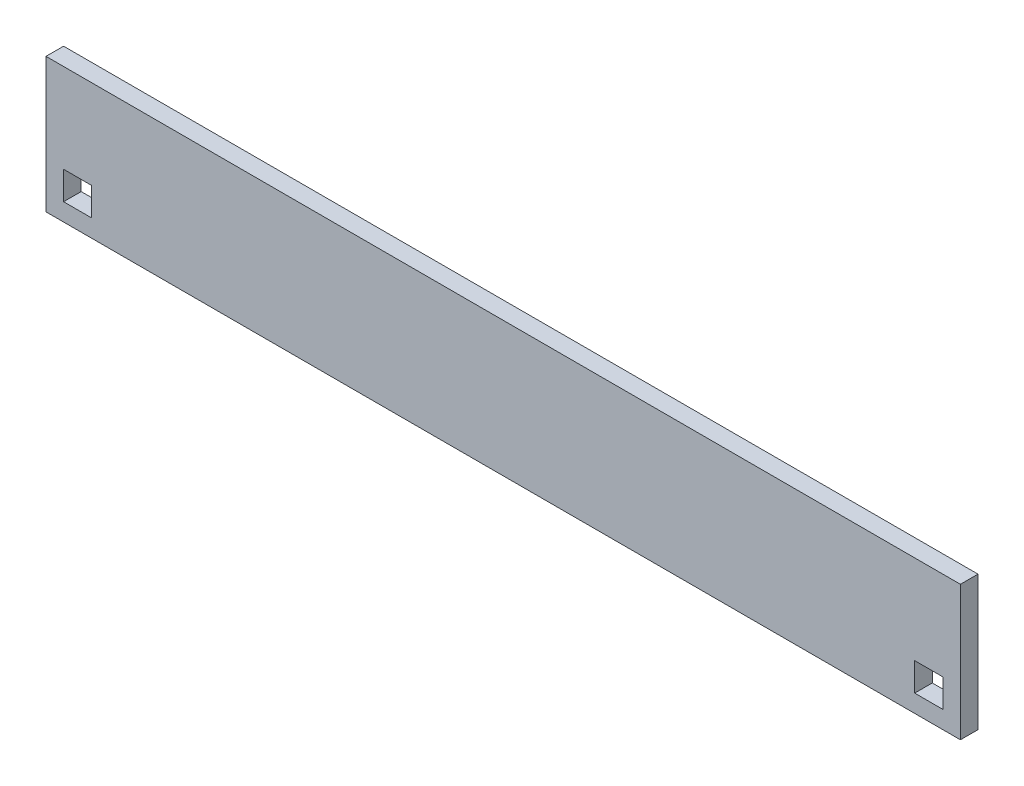
ISO-10303-21;
HEADER;
FILE_DESCRIPTION(('STEP AP214'),'2;1');
FILE_NAME('part.step','',(''),(''),'','','');
FILE_SCHEMA(('AUTOMOTIVE_DESIGN { 1 0 10303 214 1 1 1 1 }'));
ENDSEC;
DATA;
#1=APPLICATION_CONTEXT('core data for automotive mechanical design processes');
#2=APPLICATION_PROTOCOL_DEFINITION('international standard','automotive_design',2000,#1);
#3=PRODUCT_CONTEXT('',#1,'mechanical');
#4=PRODUCT('Part','Part','',(#3));
#5=PRODUCT_RELATED_PRODUCT_CATEGORY('part','',(#4));
#6=PRODUCT_DEFINITION_FORMATION('','',#4);
#7=PRODUCT_DEFINITION_CONTEXT('part definition',#1,'design');
#8=PRODUCT_DEFINITION('design','',#6,#7);
#9=PRODUCT_DEFINITION_SHAPE('','',#8);
#10=(LENGTH_UNIT() NAMED_UNIT(*) SI_UNIT(.MILLI.,.METRE.));
#11=(NAMED_UNIT(*) PLANE_ANGLE_UNIT() SI_UNIT($,.RADIAN.));
#12=(NAMED_UNIT(*) SI_UNIT($,.STERADIAN.) SOLID_ANGLE_UNIT());
#13=UNCERTAINTY_MEASURE_WITH_UNIT(LENGTH_MEASURE(1.E-05),#10,'distance_accuracy_value','');
#14=(GEOMETRIC_REPRESENTATION_CONTEXT(3) GLOBAL_UNCERTAINTY_ASSIGNED_CONTEXT((#13)) GLOBAL_UNIT_ASSIGNED_CONTEXT((#10,
#11,#12)) REPRESENTATION_CONTEXT('',''));
#15=CARTESIAN_POINT('',(0.,0.,0.));
#16=DIRECTION('',(0.,0.,1.));
#17=DIRECTION('',(1.,0.,0.));
#18=AXIS2_PLACEMENT_3D('',#15,#16,#17);
#19=CARTESIAN_POINT('',(0.,0.,5.));
#20=DIRECTION('',(1.,0.,0.));
#21=DIRECTION('',(0.,0.,-1.));
#22=AXIS2_PLACEMENT_3D('',#19,#20,#21);
#23=PLANE('',#22);
#24=DIRECTION('',(0.,-1.,0.));
#25=VECTOR('',#24,1.);
#26=CARTESIAN_POINT('',(0.,0.,0.));
#27=LINE('',#26,#25);
#28=CARTESIAN_POINT('',(0.,38.3035,0.));
#29=VERTEX_POINT('',#28);
#30=CARTESIAN_POINT('',(0.,0.,0.));
#31=VERTEX_POINT('',#30);
#32=EDGE_CURVE('E150',#29,#31,#27,.T.);
#33=ORIENTED_EDGE('',*,*,#32,.T.);
#34=DIRECTION('',(0.,0.,-1.));
#35=VECTOR('',#34,1.);
#36=CARTESIAN_POINT('',(0.,0.,5.));
#37=LINE('',#36,#35);
#38=CARTESIAN_POINT('',(0.,0.,5.));
#39=VERTEX_POINT('',#38);
#40=EDGE_CURVE('E197',#39,#31,#37,.T.);
#41=ORIENTED_EDGE('',*,*,#40,.F.);
#42=DIRECTION('',(0.,-1.,0.));
#43=VECTOR('',#42,1.);
#44=CARTESIAN_POINT('',(0.,0.,5.));
#45=LINE('',#44,#43);
#46=CARTESIAN_POINT('',(0.,38.3035,5.));
#47=VERTEX_POINT('',#46);
#48=EDGE_CURVE('E171',#47,#39,#45,.T.);
#49=ORIENTED_EDGE('',*,*,#48,.F.);
#50=DIRECTION('',(0.,0.,-1.));
#51=VECTOR('',#50,1.);
#52=CARTESIAN_POINT('',(0.,38.3035,5.));
#53=LINE('',#52,#51);
#54=EDGE_CURVE('E181',#47,#29,#53,.T.);
#55=ORIENTED_EDGE('',*,*,#54,.T.);
#56=EDGE_LOOP('',(#33,#41,#49,#55));
#57=FACE_BOUND('',#56,.T.);
#58=ADVANCED_FACE('F32',(#57),#23,.F.);
#59=CARTESIAN_POINT('',(0.,0.,5.));
#60=DIRECTION('',(0.,1.,0.));
#61=DIRECTION('',(0.,0.,1.));
#62=AXIS2_PLACEMENT_3D('',#59,#60,#61);
#63=PLANE('',#62);
#64=DIRECTION('',(1.,0.,0.));
#65=VECTOR('',#64,1.);
#66=CARTESIAN_POINT('',(0.,0.,0.));
#67=LINE('',#66,#65);
#68=CARTESIAN_POINT('',(260.,0.,0.));
#69=VERTEX_POINT('',#68);
#70=EDGE_CURVE('E184',#31,#69,#67,.T.);
#71=ORIENTED_EDGE('',*,*,#70,.T.);
#72=DIRECTION('',(0.,0.,-1.));
#73=VECTOR('',#72,1.);
#74=CARTESIAN_POINT('',(260.,0.,5.));
#75=LINE('',#74,#73);
#76=CARTESIAN_POINT('',(260.,0.,5.));
#77=VERTEX_POINT('',#76);
#78=EDGE_CURVE('E194',#77,#69,#75,.T.);
#79=ORIENTED_EDGE('',*,*,#78,.F.);
#80=DIRECTION('',(1.,0.,0.));
#81=VECTOR('',#80,1.);
#82=CARTESIAN_POINT('',(0.,0.,5.));
#83=LINE('',#82,#81);
#84=EDGE_CURVE('E174',#39,#77,#83,.T.);
#85=ORIENTED_EDGE('',*,*,#84,.F.);
#86=ORIENTED_EDGE('',*,*,#40,.T.);
#87=EDGE_LOOP('',(#71,#79,#85,#86));
#88=FACE_BOUND('',#87,.T.);
#89=ADVANCED_FACE('F234',(#88),#63,.F.);
#90=CARTESIAN_POINT('',(260.,0.,5.));
#91=DIRECTION('',(-1.,0.,0.));
#92=DIRECTION('',(0.,0.,1.));
#93=AXIS2_PLACEMENT_3D('',#90,#91,#92);
#94=PLANE('',#93);
#95=DIRECTION('',(0.,1.,0.));
#96=VECTOR('',#95,1.);
#97=CARTESIAN_POINT('',(260.,0.,0.));
#98=LINE('',#97,#96);
#99=CARTESIAN_POINT('',(260.,38.3035,0.));
#100=VERTEX_POINT('',#99);
#101=EDGE_CURVE('E186',#69,#100,#98,.T.);
#102=ORIENTED_EDGE('',*,*,#101,.T.);
#103=DIRECTION('',(0.,0.,-1.));
#104=VECTOR('',#103,1.);
#105=CARTESIAN_POINT('',(260.,38.3035,5.));
#106=LINE('',#105,#104);
#107=CARTESIAN_POINT('',(260.,38.3035,5.));
#108=VERTEX_POINT('',#107);
#109=EDGE_CURVE('E191',#108,#100,#106,.T.);
#110=ORIENTED_EDGE('',*,*,#109,.F.);
#111=DIRECTION('',(0.,1.,0.));
#112=VECTOR('',#111,1.);
#113=CARTESIAN_POINT('',(260.,0.,5.));
#114=LINE('',#113,#112);
#115=EDGE_CURVE('E177',#77,#108,#114,.T.);
#116=ORIENTED_EDGE('',*,*,#115,.F.);
#117=ORIENTED_EDGE('',*,*,#78,.T.);
#118=EDGE_LOOP('',(#102,#110,#116,#117));
#119=FACE_BOUND('',#118,.T.);
#120=ADVANCED_FACE('F239',(#119),#94,.F.);
#121=CARTESIAN_POINT('',(0.,38.3035,5.));
#122=DIRECTION('',(0.,-1.,0.));
#123=DIRECTION('',(0.,0.,-1.));
#124=AXIS2_PLACEMENT_3D('',#121,#122,#123);
#125=PLANE('',#124);
#126=DIRECTION('',(-1.,0.,0.));
#127=VECTOR('',#126,1.);
#128=CARTESIAN_POINT('',(0.,38.3035,0.));
#129=LINE('',#128,#127);
#130=EDGE_CURVE('E175',#100,#29,#129,.T.);
#131=ORIENTED_EDGE('',*,*,#130,.T.);
#132=ORIENTED_EDGE('',*,*,#54,.F.);
#133=DIRECTION('',(-1.,0.,0.));
#134=VECTOR('',#133,1.);
#135=CARTESIAN_POINT('',(0.,38.3035,5.));
#136=LINE('',#135,#134);
#137=EDGE_CURVE('E179',#108,#47,#136,.T.);
#138=ORIENTED_EDGE('',*,*,#137,.F.);
#139=ORIENTED_EDGE('',*,*,#109,.T.);
#140=EDGE_LOOP('',(#131,#132,#138,#139));
#141=FACE_BOUND('',#140,.T.);
#142=ADVANCED_FACE('F254',(#141),#125,.F.);
#143=CARTESIAN_POINT('',(0.,0.,5.));
#144=DIRECTION('',(0.,0.,-1.));
#145=DIRECTION('',(-1.,0.,0.));
#146=AXIS2_PLACEMENT_3D('',#143,#144,#145);
#147=PLANE('',#146);
#148=DIRECTION('',(1.,0.,0.));
#149=VECTOR('',#148,1.);
#150=CARTESIAN_POINT('',(5.,5.,5.));
#151=LINE('',#150,#149);
#152=CARTESIAN_POINT('',(5.,5.,5.));
#153=VERTEX_POINT('',#152);
#154=CARTESIAN_POINT('',(13.,5.,5.));
#155=VERTEX_POINT('',#154);
#156=EDGE_CURVE('E136',#153,#155,#151,.T.);
#157=ORIENTED_EDGE('',*,*,#156,.F.);
#158=DIRECTION('',(0.,-1.,0.));
#159=VECTOR('',#158,1.);
#160=CARTESIAN_POINT('',(5.,13.,5.));
#161=LINE('',#160,#159);
#162=CARTESIAN_POINT('',(5.,13.,5.));
#163=VERTEX_POINT('',#162);
#164=EDGE_CURVE('E46',#163,#153,#161,.T.);
#165=ORIENTED_EDGE('',*,*,#164,.F.);
#166=DIRECTION('',(-1.,0.,0.));
#167=VECTOR('',#166,1.);
#168=CARTESIAN_POINT('',(5.,13.,5.));
#169=LINE('',#168,#167);
#170=CARTESIAN_POINT('',(13.,13.,5.));
#171=VERTEX_POINT('',#170);
#172=EDGE_CURVE('E143',#171,#163,#169,.T.);
#173=ORIENTED_EDGE('',*,*,#172,.F.);
#174=DIRECTION('',(0.,1.,0.));
#175=VECTOR('',#174,1.);
#176=CARTESIAN_POINT('',(13.,13.,5.));
#177=LINE('',#176,#175);
#178=EDGE_CURVE('E126',#155,#171,#177,.T.);
#179=ORIENTED_EDGE('',*,*,#178,.F.);
#180=EDGE_LOOP('',(#157,#165,#173,#179));
#181=FACE_BOUND('',#180,.T.);
#182=DIRECTION('',(-1.,0.,0.));
#183=VECTOR('',#182,1.);
#184=CARTESIAN_POINT('',(255.,13.,5.));
#185=LINE('',#184,#183);
#186=CARTESIAN_POINT('',(255.,13.,5.));
#187=VERTEX_POINT('',#186);
#188=CARTESIAN_POINT('',(247.,13.,5.));
#189=VERTEX_POINT('',#188);
#190=EDGE_CURVE('E154',#187,#189,#185,.T.);
#191=ORIENTED_EDGE('',*,*,#190,.F.);
#192=DIRECTION('',(0.,1.,0.));
#193=VECTOR('',#192,1.);
#194=CARTESIAN_POINT('',(255.,13.,5.));
#195=LINE('',#194,#193);
#196=CARTESIAN_POINT('',(255.,5.,5.));
#197=VERTEX_POINT('',#196);
#198=EDGE_CURVE('E54',#197,#187,#195,.T.);
#199=ORIENTED_EDGE('',*,*,#198,.F.);
#200=DIRECTION('',(1.,0.,0.));
#201=VECTOR('',#200,1.);
#202=CARTESIAN_POINT('',(255.,5.,5.));
#203=LINE('',#202,#201);
#204=CARTESIAN_POINT('',(247.,5.,5.));
#205=VERTEX_POINT('',#204);
#206=EDGE_CURVE('E160',#205,#197,#203,.T.);
#207=ORIENTED_EDGE('',*,*,#206,.F.);
#208=DIRECTION('',(0.,-1.,0.));
#209=VECTOR('',#208,1.);
#210=CARTESIAN_POINT('',(247.,13.,5.));
#211=LINE('',#210,#209);
#212=EDGE_CURVE('E157',#189,#205,#211,.T.);
#213=ORIENTED_EDGE('',*,*,#212,.F.);
#214=EDGE_LOOP('',(#191,#199,#207,#213));
#215=FACE_BOUND('',#214,.T.);
#216=ORIENTED_EDGE('',*,*,#48,.T.);
#217=ORIENTED_EDGE('',*,*,#84,.T.);
#218=ORIENTED_EDGE('',*,*,#115,.T.);
#219=ORIENTED_EDGE('',*,*,#137,.T.);
#220=EDGE_LOOP('',(#216,#217,#218,#219));
#221=FACE_BOUND('',#220,.T.);
#222=ADVANCED_FACE('F140',(#181,#215,#221),#147,.F.);
#223=CARTESIAN_POINT('',(0.,0.,0.));
#224=DIRECTION('',(0.,0.,-1.));
#225=DIRECTION('',(-1.,0.,0.));
#226=AXIS2_PLACEMENT_3D('',#223,#224,#225);
#227=PLANE('',#226);
#228=DIRECTION('',(0.,1.,0.));
#229=VECTOR('',#228,1.);
#230=CARTESIAN_POINT('',(5.,0.,0.));
#231=LINE('',#230,#229);
#232=CARTESIAN_POINT('',(5.,5.,0.));
#233=VERTEX_POINT('',#232);
#234=CARTESIAN_POINT('',(5.,13.,0.));
#235=VERTEX_POINT('',#234);
#236=EDGE_CURVE('E11',#233,#235,#231,.T.);
#237=ORIENTED_EDGE('',*,*,#236,.F.);
#238=DIRECTION('',(-1.,0.,0.));
#239=VECTOR('',#238,1.);
#240=CARTESIAN_POINT('',(0.,5.,0.));
#241=LINE('',#240,#239);
#242=CARTESIAN_POINT('',(13.,5.,0.));
#243=VERTEX_POINT('',#242);
#244=EDGE_CURVE('E209',#243,#233,#241,.T.);
#245=ORIENTED_EDGE('',*,*,#244,.F.);
#246=DIRECTION('',(0.,-1.,0.));
#247=VECTOR('',#246,1.);
#248=CARTESIAN_POINT('',(13.,0.,0.));
#249=LINE('',#248,#247);
#250=CARTESIAN_POINT('',(13.,13.,0.));
#251=VERTEX_POINT('',#250);
#252=EDGE_CURVE('E129',#251,#243,#249,.T.);
#253=ORIENTED_EDGE('',*,*,#252,.F.);
#254=DIRECTION('',(1.,0.,0.));
#255=VECTOR('',#254,1.);
#256=CARTESIAN_POINT('',(0.,13.,0.));
#257=LINE('',#256,#255);
#258=EDGE_CURVE('E39',#235,#251,#257,.T.);
#259=ORIENTED_EDGE('',*,*,#258,.F.);
#260=EDGE_LOOP('',(#237,#245,#253,#259));
#261=FACE_BOUND('',#260,.T.);
#262=DIRECTION('',(0.,-1.,0.));
#263=VECTOR('',#262,1.);
#264=CARTESIAN_POINT('',(255.,0.,0.));
#265=LINE('',#264,#263);
#266=CARTESIAN_POINT('',(255.,13.,0.));
#267=VERTEX_POINT('',#266);
#268=CARTESIAN_POINT('',(255.,5.,0.));
#269=VERTEX_POINT('',#268);
#270=EDGE_CURVE('E207',#267,#269,#265,.T.);
#271=ORIENTED_EDGE('',*,*,#270,.F.);
#272=DIRECTION('',(1.,0.,0.));
#273=VECTOR('',#272,1.);
#274=CARTESIAN_POINT('',(0.,13.,0.));
#275=LINE('',#274,#273);
#276=CARTESIAN_POINT('',(247.,13.,0.));
#277=VERTEX_POINT('',#276);
#278=EDGE_CURVE('E200',#277,#267,#275,.T.);
#279=ORIENTED_EDGE('',*,*,#278,.F.);
#280=DIRECTION('',(0.,1.,0.));
#281=VECTOR('',#280,1.);
#282=CARTESIAN_POINT('',(247.,0.,0.));
#283=LINE('',#282,#281);
#284=CARTESIAN_POINT('',(247.,5.,0.));
#285=VERTEX_POINT('',#284);
#286=EDGE_CURVE('E202',#285,#277,#283,.T.);
#287=ORIENTED_EDGE('',*,*,#286,.F.);
#288=DIRECTION('',(-1.,0.,0.));
#289=VECTOR('',#288,1.);
#290=CARTESIAN_POINT('',(0.,5.,0.));
#291=LINE('',#290,#289);
#292=EDGE_CURVE('E205',#269,#285,#291,.T.);
#293=ORIENTED_EDGE('',*,*,#292,.F.);
#294=EDGE_LOOP('',(#271,#279,#287,#293));
#295=FACE_BOUND('',#294,.T.);
#296=ORIENTED_EDGE('',*,*,#32,.F.);
#297=ORIENTED_EDGE('',*,*,#130,.F.);
#298=ORIENTED_EDGE('',*,*,#101,.F.);
#299=ORIENTED_EDGE('',*,*,#70,.F.);
#300=EDGE_LOOP('',(#296,#297,#298,#299));
#301=FACE_BOUND('',#300,.T.);
#302=ADVANCED_FACE('F217',(#261,#295,#301),#227,.T.);
#303=CARTESIAN_POINT('',(255.,13.,-5.));
#304=DIRECTION('',(1.,0.,0.));
#305=DIRECTION('',(0.,0.,-1.));
#306=AXIS2_PLACEMENT_3D('',#303,#304,#305);
#307=PLANE('',#306);
#308=ORIENTED_EDGE('',*,*,#270,.T.);
#309=DIRECTION('',(0.,0.,1.));
#310=VECTOR('',#309,1.);
#311=CARTESIAN_POINT('',(255.,5.,-5.));
#312=LINE('',#311,#310);
#313=EDGE_CURVE('E164',#269,#197,#312,.T.);
#314=ORIENTED_EDGE('',*,*,#313,.T.);
#315=ORIENTED_EDGE('',*,*,#198,.T.);
#316=DIRECTION('',(0.,0.,1.));
#317=VECTOR('',#316,1.);
#318=CARTESIAN_POINT('',(255.,13.,-5.));
#319=LINE('',#318,#317);
#320=EDGE_CURVE('E163',#267,#187,#319,.T.);
#321=ORIENTED_EDGE('',*,*,#320,.F.);
#322=EDGE_LOOP('',(#308,#314,#315,#321));
#323=FACE_BOUND('',#322,.T.);
#324=ADVANCED_FACE('F265',(#323),#307,.F.);
#325=CARTESIAN_POINT('',(255.,5.,-5.));
#326=DIRECTION('',(0.,-1.,0.));
#327=DIRECTION('',(0.,0.,-1.));
#328=AXIS2_PLACEMENT_3D('',#325,#326,#327);
#329=PLANE('',#328);
#330=ORIENTED_EDGE('',*,*,#292,.T.);
#331=DIRECTION('',(0.,0.,1.));
#332=VECTOR('',#331,1.);
#333=CARTESIAN_POINT('',(247.,5.,-5.));
#334=LINE('',#333,#332);
#335=EDGE_CURVE('E166',#285,#205,#334,.T.);
#336=ORIENTED_EDGE('',*,*,#335,.T.);
#337=ORIENTED_EDGE('',*,*,#206,.T.);
#338=ORIENTED_EDGE('',*,*,#313,.F.);
#339=EDGE_LOOP('',(#330,#336,#337,#338));
#340=FACE_BOUND('',#339,.T.);
#341=ADVANCED_FACE('F269',(#340),#329,.F.);
#342=CARTESIAN_POINT('',(247.,13.,-5.));
#343=DIRECTION('',(-1.,0.,0.));
#344=DIRECTION('',(0.,0.,1.));
#345=AXIS2_PLACEMENT_3D('',#342,#343,#344);
#346=PLANE('',#345);
#347=ORIENTED_EDGE('',*,*,#286,.T.);
#348=DIRECTION('',(0.,0.,1.));
#349=VECTOR('',#348,1.);
#350=CARTESIAN_POINT('',(247.,13.,-5.));
#351=LINE('',#350,#349);
#352=EDGE_CURVE('E168',#277,#189,#351,.T.);
#353=ORIENTED_EDGE('',*,*,#352,.T.);
#354=ORIENTED_EDGE('',*,*,#212,.T.);
#355=ORIENTED_EDGE('',*,*,#335,.F.);
#356=EDGE_LOOP('',(#347,#353,#354,#355));
#357=FACE_BOUND('',#356,.T.);
#358=ADVANCED_FACE('F228',(#357),#346,.F.);
#359=CARTESIAN_POINT('',(255.,13.,-5.));
#360=DIRECTION('',(0.,1.,0.));
#361=DIRECTION('',(0.,0.,1.));
#362=AXIS2_PLACEMENT_3D('',#359,#360,#361);
#363=PLANE('',#362);
#364=ORIENTED_EDGE('',*,*,#278,.T.);
#365=ORIENTED_EDGE('',*,*,#320,.T.);
#366=ORIENTED_EDGE('',*,*,#190,.T.);
#367=ORIENTED_EDGE('',*,*,#352,.F.);
#368=EDGE_LOOP('',(#364,#365,#366,#367));
#369=FACE_BOUND('',#368,.T.);
#370=ADVANCED_FACE('F221',(#369),#363,.F.);
#371=CARTESIAN_POINT('',(5.,13.,-5.));
#372=DIRECTION('',(-1.,0.,0.));
#373=DIRECTION('',(0.,-1.,0.));
#374=AXIS2_PLACEMENT_3D('',#371,#372,#373);
#375=PLANE('',#374);
#376=ORIENTED_EDGE('',*,*,#236,.T.);
#377=DIRECTION('',(0.,0.,1.));
#378=VECTOR('',#377,1.);
#379=CARTESIAN_POINT('',(5.,13.,-5.));
#380=LINE('',#379,#378);
#381=EDGE_CURVE('E148',#235,#163,#380,.T.);
#382=ORIENTED_EDGE('',*,*,#381,.T.);
#383=ORIENTED_EDGE('',*,*,#164,.T.);
#384=DIRECTION('',(0.,0.,1.));
#385=VECTOR('',#384,1.);
#386=CARTESIAN_POINT('',(5.,5.,-5.));
#387=LINE('',#386,#385);
#388=EDGE_CURVE('E133',#233,#153,#387,.T.);
#389=ORIENTED_EDGE('',*,*,#388,.F.);
#390=EDGE_LOOP('',(#376,#382,#383,#389));
#391=FACE_BOUND('',#390,.T.);
#392=ADVANCED_FACE('F219',(#391),#375,.F.);
#393=CARTESIAN_POINT('',(5.,13.,-5.));
#394=DIRECTION('',(0.,1.,0.));
#395=DIRECTION('',(0.,0.,1.));
#396=AXIS2_PLACEMENT_3D('',#393,#394,#395);
#397=PLANE('',#396);
#398=ORIENTED_EDGE('',*,*,#258,.T.);
#399=DIRECTION('',(0.,0.,1.));
#400=VECTOR('',#399,1.);
#401=CARTESIAN_POINT('',(13.,13.,-5.));
#402=LINE('',#401,#400);
#403=EDGE_CURVE('E132',#251,#171,#402,.T.);
#404=ORIENTED_EDGE('',*,*,#403,.T.);
#405=ORIENTED_EDGE('',*,*,#172,.T.);
#406=ORIENTED_EDGE('',*,*,#381,.F.);
#407=EDGE_LOOP('',(#398,#404,#405,#406));
#408=FACE_BOUND('',#407,.T.);
#409=ADVANCED_FACE('F214',(#408),#397,.F.);
#410=CARTESIAN_POINT('',(13.,13.,-5.));
#411=DIRECTION('',(1.,0.,0.));
#412=DIRECTION('',(0.,1.,0.));
#413=AXIS2_PLACEMENT_3D('',#410,#411,#412);
#414=PLANE('',#413);
#415=ORIENTED_EDGE('',*,*,#252,.T.);
#416=DIRECTION('',(0.,0.,1.));
#417=VECTOR('',#416,1.);
#418=CARTESIAN_POINT('',(13.,5.,-5.));
#419=LINE('',#418,#417);
#420=EDGE_CURVE('E121',#243,#155,#419,.T.);
#421=ORIENTED_EDGE('',*,*,#420,.T.);
#422=ORIENTED_EDGE('',*,*,#178,.T.);
#423=ORIENTED_EDGE('',*,*,#403,.F.);
#424=EDGE_LOOP('',(#415,#421,#422,#423));
#425=FACE_BOUND('',#424,.T.);
#426=ADVANCED_FACE('F123',(#425),#414,.F.);
#427=CARTESIAN_POINT('',(5.,5.,-5.));
#428=DIRECTION('',(0.,-1.,0.));
#429=DIRECTION('',(0.,0.,-1.));
#430=AXIS2_PLACEMENT_3D('',#427,#428,#429);
#431=PLANE('',#430);
#432=ORIENTED_EDGE('',*,*,#244,.T.);
#433=ORIENTED_EDGE('',*,*,#388,.T.);
#434=ORIENTED_EDGE('',*,*,#156,.T.);
#435=ORIENTED_EDGE('',*,*,#420,.F.);
#436=EDGE_LOOP('',(#432,#433,#434,#435));
#437=FACE_BOUND('',#436,.T.);
#438=ADVANCED_FACE('F137',(#437),#431,.F.);
#439=CLOSED_SHELL('',(#58,#89,#120,#142,#222,#302,#324,#341,#358,#370,#392,#409,#426,#438));
#440=MANIFOLD_SOLID_BREP('B2',#439);
#441=ADVANCED_BREP_SHAPE_REPRESENTATION('',(#18,#440),#14);
#442=SHAPE_DEFINITION_REPRESENTATION(#9,#441);
ENDSEC;
END-ISO-10303-21;
